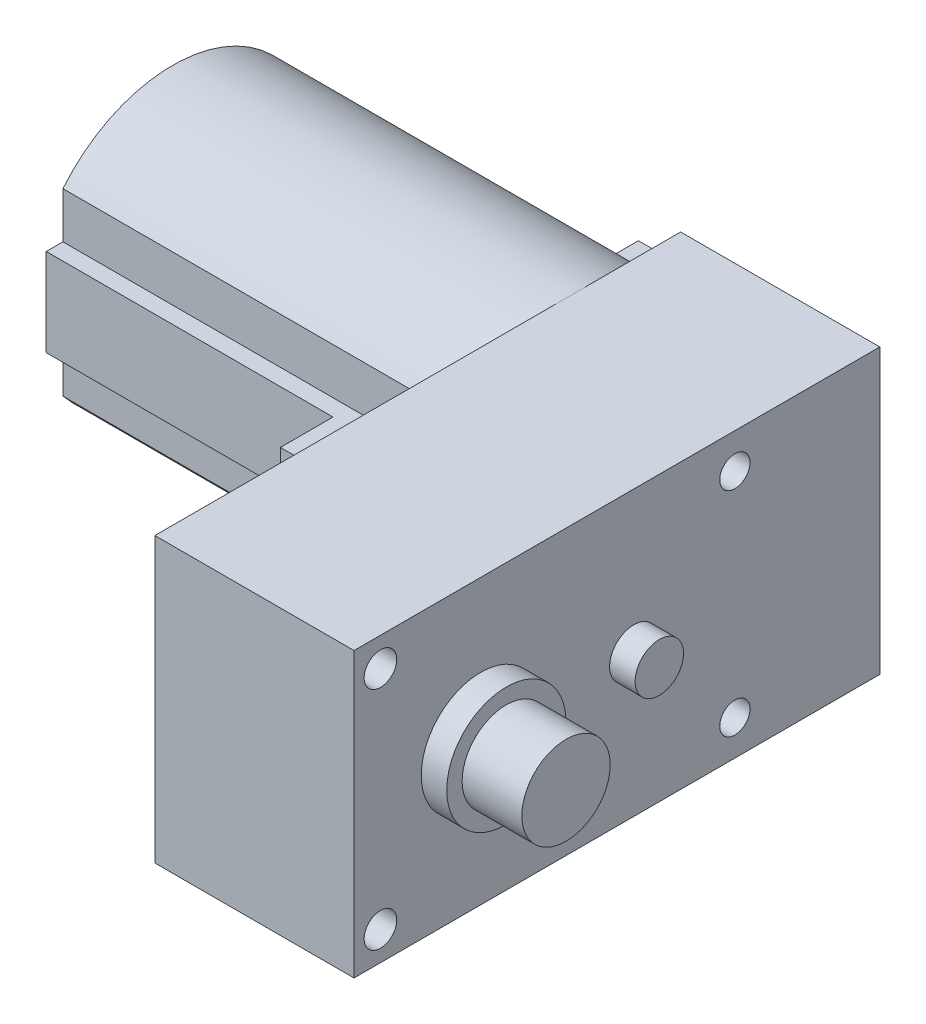
ISO-10303-21;
HEADER;
FILE_DESCRIPTION(('STEP AP214'),'2;1');
FILE_NAME('part.step','',(''),(''),'','','');
FILE_SCHEMA(('AUTOMOTIVE_DESIGN { 1 0 10303 214 1 1 1 1 }'));
ENDSEC;
DATA;
#1=APPLICATION_CONTEXT('core data for automotive mechanical design processes');
#2=APPLICATION_PROTOCOL_DEFINITION('international standard','automotive_design',2000,#1);
#3=PRODUCT_CONTEXT('',#1,'mechanical');
#4=PRODUCT('Part','Part','',(#3));
#5=PRODUCT_RELATED_PRODUCT_CATEGORY('part','',(#4));
#6=PRODUCT_DEFINITION_FORMATION('','',#4);
#7=PRODUCT_DEFINITION_CONTEXT('part definition',#1,'design');
#8=PRODUCT_DEFINITION('design','',#6,#7);
#9=PRODUCT_DEFINITION_SHAPE('','',#8);
#10=(LENGTH_UNIT() NAMED_UNIT(*) SI_UNIT(.MILLI.,.METRE.));
#11=(NAMED_UNIT(*) PLANE_ANGLE_UNIT() SI_UNIT($,.RADIAN.));
#12=(NAMED_UNIT(*) SI_UNIT($,.STERADIAN.) SOLID_ANGLE_UNIT());
#13=UNCERTAINTY_MEASURE_WITH_UNIT(LENGTH_MEASURE(1.E-05),#10,'distance_accuracy_value','');
#14=(GEOMETRIC_REPRESENTATION_CONTEXT(3) GLOBAL_UNCERTAINTY_ASSIGNED_CONTEXT((#13)) GLOBAL_UNIT_ASSIGNED_CONTEXT((#10,
#11,#12)) REPRESENTATION_CONTEXT('',''));
#15=CARTESIAN_POINT('',(0.,0.,0.));
#16=DIRECTION('',(0.,0.,1.));
#17=DIRECTION('',(1.,0.,0.));
#18=AXIS2_PLACEMENT_3D('',#15,#16,#17);
#19=CARTESIAN_POINT('',(-4.9784,10.274808,-11.134852));
#20=DIRECTION('',(-1.,0.,0.));
#21=DIRECTION('',(0.,0.,1.));
#22=AXIS2_PLACEMENT_3D('',#19,#20,#21);
#23=PLANE('',#22);
#24=CARTESIAN_POINT('',(-4.9784,11.303,-10.10666));
#25=DIRECTION('',(1.,0.,0.));
#26=DIRECTION('',(0.,0.,-1.));
#27=AXIS2_PLACEMENT_3D('',#24,#25,#26);
#28=CIRCLE('',#27,1.016);
#29=CARTESIAN_POINT('',(-4.9784,11.303,-11.12266));
#30=VERTEX_POINT('',#29);
#31=EDGE_CURVE('E19',#30,#30,#28,.T.);
#32=ORIENTED_EDGE('',*,*,#31,.F.);
#33=EDGE_LOOP('',(#32));
#34=FACE_BOUND('',#33,.T.);
#35=ADVANCED_FACE('F16',(#34),#23,.T.);
#36=CARTESIAN_POINT('',(-4.9784,11.303,-10.10666));
#37=DIRECTION('',(1.,0.,0.));
#38=DIRECTION('',(0.,0.,-1.));
#39=AXIS2_PLACEMENT_3D('',#36,#37,#38);
#40=CYLINDRICAL_SURFACE('',#39,1.016);
#41=ORIENTED_EDGE('',*,*,#31,.T.);
#42=EDGE_LOOP('',(#41));
#43=FACE_BOUND('',#42,.T.);
#44=CARTESIAN_POINT('',(0.,11.303,-10.10666));
#45=DIRECTION('',(1.,0.,0.));
#46=DIRECTION('',(0.,0.,-1.));
#47=AXIS2_PLACEMENT_3D('',#44,#45,#46);
#48=CIRCLE('',#47,1.016);
#49=CARTESIAN_POINT('',(0.,11.303,-11.12266));
#50=VERTEX_POINT('',#49);
#51=EDGE_CURVE('E425',#50,#50,#48,.T.);
#52=ORIENTED_EDGE('',*,*,#51,.F.);
#53=EDGE_LOOP('',(#52));
#54=FACE_BOUND('',#53,.T.);
#55=ADVANCED_FACE('F432',(#43,#54),#40,.T.);
#56=CARTESIAN_POINT('',(0.,7.7300328,-13.6796272));
#57=DIRECTION('',(-1.,0.,0.));
#58=DIRECTION('',(0.,0.,1.));
#59=AXIS2_PLACEMENT_3D('',#56,#57,#58);
#60=PLANE('',#59);
#61=CARTESIAN_POINT('',(0.,11.303,-10.10666));
#62=DIRECTION('',(1.,0.,0.));
#63=DIRECTION('',(0.,0.,-1.));
#64=AXIS2_PLACEMENT_3D('',#61,#62,#63);
#65=CIRCLE('',#64,3.5306);
#66=CARTESIAN_POINT('',(0.,11.303,-13.63726));
#67=VERTEX_POINT('',#66);
#68=EDGE_CURVE('E423',#67,#67,#65,.F.);
#69=ORIENTED_EDGE('',*,*,#68,.T.);
#70=EDGE_LOOP('',(#69));
#71=FACE_BOUND('',#70,.T.);
#72=ORIENTED_EDGE('',*,*,#51,.T.);
#73=EDGE_LOOP('',(#72));
#74=FACE_BOUND('',#73,.T.);
#75=ADVANCED_FACE('F440',(#71,#74),#60,.T.);
#76=CARTESIAN_POINT('',(-2.794,11.303,-10.10666));
#77=DIRECTION('',(1.,0.,0.));
#78=DIRECTION('',(0.,0.,-1.));
#79=AXIS2_PLACEMENT_3D('',#76,#77,#78);
#80=CYLINDRICAL_SURFACE('',#79,3.5306);
#81=ORIENTED_EDGE('',*,*,#68,.F.);
#82=EDGE_LOOP('',(#81));
#83=FACE_BOUND('',#82,.T.);
#84=CARTESIAN_POINT('',(-2.794,11.303,-10.10666));
#85=DIRECTION('',(1.,0.,0.));
#86=DIRECTION('',(0.,0.,-1.));
#87=AXIS2_PLACEMENT_3D('',#84,#85,#86);
#88=CIRCLE('',#87,3.5306);
#89=CARTESIAN_POINT('',(-2.794,11.303,-13.63726));
#90=VERTEX_POINT('',#89);
#91=EDGE_CURVE('E420',#90,#90,#88,.T.);
#92=ORIENTED_EDGE('',*,*,#91,.F.);
#93=EDGE_LOOP('',(#92));
#94=FACE_BOUND('',#93,.T.);
#95=ADVANCED_FACE('F596',(#83,#94),#80,.F.);
#96=CARTESIAN_POINT('',(22.6695,7.7405543182,-6.5442143182));
#97=DIRECTION('',(1.,0.,0.));
#98=DIRECTION('',(0.,0.,-1.));
#99=AXIS2_PLACEMENT_3D('',#96,#97,#98);
#100=PLANE('',#99);
#101=CARTESIAN_POINT('',(22.6695,11.303,-10.10666));
#102=DIRECTION('',(-1.,0.,0.));
#103=DIRECTION('',(0.,0.,1.));
#104=AXIS2_PLACEMENT_3D('',#101,#102,#103);
#105=CIRCLE('',#104,3.5202032466);
#106=CARTESIAN_POINT('',(22.6695,11.303,-6.5864567534));
#107=VERTEX_POINT('',#106);
#108=EDGE_CURVE('E417',#107,#107,#105,.T.);
#109=ORIENTED_EDGE('',*,*,#108,.F.);
#110=EDGE_LOOP('',(#109));
#111=FACE_BOUND('',#110,.T.);
#112=ADVANCED_FACE('F592',(#111),#100,.T.);
#113=CARTESIAN_POINT('',(-33.02,10.2940866,-34.1752239532));
#114=DIRECTION('',(-1.,0.,0.));
#115=DIRECTION('',(0.,0.,1.));
#116=AXIS2_PLACEMENT_3D('',#113,#114,#115);
#117=PLANE('',#116);
#118=CARTESIAN_POINT('',(-33.02,11.303,-33.1663105532));
#119=DIRECTION('',(1.,0.,0.));
#120=DIRECTION('',(0.,0.,-1.));
#121=AXIS2_PLACEMENT_3D('',#118,#119,#120);
#122=CIRCLE('',#121,0.99695000000001);
#123=CARTESIAN_POINT('',(-33.02,11.303,-34.1632605532));
#124=VERTEX_POINT('',#123);
#125=EDGE_CURVE('E357',#124,#124,#122,.T.);
#126=ORIENTED_EDGE('',*,*,#125,.F.);
#127=EDGE_LOOP('',(#126));
#128=FACE_BOUND('',#127,.T.);
#129=ADVANCED_FACE('F588',(#128),#117,.T.);
#130=CARTESIAN_POINT('',(-2.794,6.48335,-14.92631));
#131=DIRECTION('',(-1.,0.,0.));
#132=DIRECTION('',(0.,0.,1.));
#133=AXIS2_PLACEMENT_3D('',#130,#131,#132);
#134=PLANE('',#133);
#135=CARTESIAN_POINT('',(-2.794,11.303,-10.10666));
#136=DIRECTION('',(1.,0.,0.));
#137=DIRECTION('',(0.,0.,-1.));
#138=AXIS2_PLACEMENT_3D('',#135,#136,#137);
#139=CIRCLE('',#138,4.7625);
#140=CARTESIAN_POINT('',(-2.794,11.303,-14.86916));
#141=VERTEX_POINT('',#140);
#142=EDGE_CURVE('E251',#141,#141,#139,.T.);
#143=ORIENTED_EDGE('',*,*,#142,.F.);
#144=EDGE_LOOP('',(#143));
#145=FACE_BOUND('',#144,.T.);
#146=ORIENTED_EDGE('',*,*,#91,.T.);
#147=EDGE_LOOP('',(#146));
#148=FACE_BOUND('',#147,.T.);
#149=ADVANCED_FACE('F584',(#145,#148),#134,.T.);
#150=CARTESIAN_POINT('',(-8.89,7.8105,-23.0891211064));
#151=DIRECTION('',(1.,0.,0.));
#152=DIRECTION('',(0.,0.,-1.));
#153=AXIS2_PLACEMENT_3D('',#150,#151,#152);
#154=PLANE('',#153);
#155=DIRECTION('',(0.,1.,0.));
#156=VECTOR('',#155,1.);
#157=CARTESIAN_POINT('',(-8.89,7.8105,-18.8981211064));
#158=LINE('',#157,#156);
#159=CARTESIAN_POINT('',(-8.89,7.8105,-18.8981211064));
#160=VERTEX_POINT('',#159);
#161=CARTESIAN_POINT('',(-8.89,14.7955,-18.8981211064));
#162=VERTEX_POINT('',#161);
#163=EDGE_CURVE('E241',#160,#162,#158,.T.);
#164=ORIENTED_EDGE('',*,*,#163,.T.);
#165=DIRECTION('',(0.,0.,-1.));
#166=VECTOR('',#165,1.);
#167=CARTESIAN_POINT('',(-8.89,14.7955,-24.4226211064));
#168=LINE('',#167,#166);
#169=CARTESIAN_POINT('',(-8.89,14.7955000008717,-23.0891211072467));
#170=VERTEX_POINT('',#169);
#171=EDGE_CURVE('E250',#162,#170,#168,.T.);
#172=ORIENTED_EDGE('',*,*,#171,.T.);
#173=DIRECTION('',(0.,1.,0.));
#174=VECTOR('',#173,1.);
#175=CARTESIAN_POINT('',(-8.89,7.8105,-23.0891211064));
#176=LINE('',#175,#174);
#177=CARTESIAN_POINT('',(-8.89,7.8105,-23.0891211068233));
#178=VERTEX_POINT('',#177);
#179=EDGE_CURVE('E280',#170,#178,#176,.F.);
#180=ORIENTED_EDGE('',*,*,#179,.T.);
#181=DIRECTION('',(0.,0.,1.));
#182=VECTOR('',#181,1.);
#183=CARTESIAN_POINT('',(-8.89,7.8105,-24.4226211064));
#184=LINE('',#183,#182);
#185=EDGE_CURVE('E230',#178,#160,#184,.T.);
#186=ORIENTED_EDGE('',*,*,#185,.T.);
#187=EDGE_LOOP('',(#164,#172,#180,#186));
#188=FACE_BOUND('',#187,.T.);
#189=ADVANCED_FACE('F580',(#188),#154,.F.);
#190=CARTESIAN_POINT('',(22.6695,11.303,-10.10666));
#191=DIRECTION('',(-1.,0.,0.));
#192=DIRECTION('',(0.,0.,1.));
#193=AXIS2_PLACEMENT_3D('',#190,#191,#192);
#194=CYLINDRICAL_SURFACE('',#193,3.5202032466);
#195=ORIENTED_EDGE('',*,*,#108,.T.);
#196=EDGE_LOOP('',(#195));
#197=FACE_BOUND('',#196,.T.);
#198=CARTESIAN_POINT('',(17.907,11.303,-10.10666));
#199=DIRECTION('',(-1.,0.,0.));
#200=DIRECTION('',(0.,0.,1.));
#201=AXIS2_PLACEMENT_3D('',#198,#199,#200);
#202=CIRCLE('',#201,3.5202032466);
#203=CARTESIAN_POINT('',(17.907,11.303,-6.5864567534));
#204=VERTEX_POINT('',#203);
#205=EDGE_CURVE('E215',#204,#204,#202,.T.);
#206=ORIENTED_EDGE('',*,*,#205,.F.);
#207=EDGE_LOOP('',(#206));
#208=FACE_BOUND('',#207,.T.);
#209=ADVANCED_FACE('F576',(#197,#208),#194,.T.);
#210=CARTESIAN_POINT('',(-33.02,11.303,-33.1663105532));
#211=DIRECTION('',(1.,0.,0.));
#212=DIRECTION('',(0.,0.,-1.));
#213=AXIS2_PLACEMENT_3D('',#210,#211,#212);
#214=CYLINDRICAL_SURFACE('',#213,0.99695000000001);
#215=ORIENTED_EDGE('',*,*,#125,.T.);
#216=EDGE_LOOP('',(#215));
#217=FACE_BOUND('',#216,.T.);
#218=CARTESIAN_POINT('',(-31.75,11.303,-33.1663105532));
#219=DIRECTION('',(1.,0.,0.));
#220=DIRECTION('',(0.,0.,-1.));
#221=AXIS2_PLACEMENT_3D('',#218,#219,#220);
#222=CIRCLE('',#221,0.99695000000001);
#223=CARTESIAN_POINT('',(-31.75,11.303,-34.1632605532));
#224=VERTEX_POINT('',#223);
#225=EDGE_CURVE('E255',#224,#224,#222,.T.);
#226=ORIENTED_EDGE('',*,*,#225,.F.);
#227=EDGE_LOOP('',(#226));
#228=FACE_BOUND('',#227,.T.);
#229=ADVANCED_FACE('F572',(#217,#228),#214,.T.);
#230=CARTESIAN_POINT('',(-8.89,7.8105,-23.0891211064));
#231=DIRECTION('',(0.,0.,-1.));
#232=DIRECTION('',(-1.,0.,0.));
#233=AXIS2_PLACEMENT_3D('',#230,#231,#232);
#234=PLANE('',#233);
#235=DIRECTION('',(0.,1.,0.));
#236=VECTOR('',#235,1.);
#237=CARTESIAN_POINT('',(-31.75,-0.135636,-23.089121107035));
#238=LINE('',#237,#236);
#239=CARTESIAN_POINT('',(-31.75,7.81049999891034,-23.0891211069821));
#240=VERTEX_POINT('',#239);
#241=CARTESIAN_POINT('',(-31.75,14.7955000017435,-23.0891211071408));
#242=VERTEX_POINT('',#241);
#243=EDGE_CURVE('E326',#240,#242,#238,.T.);
#244=ORIENTED_EDGE('',*,*,#243,.F.);
#245=DIRECTION('',(1.,0.,0.));
#246=VECTOR('',#245,1.);
#247=CARTESIAN_POINT('',(-31.75,7.8105,-23.089121107035));
#248=LINE('',#247,#246);
#249=EDGE_CURVE('E240',#240,#178,#248,.T.);
#250=ORIENTED_EDGE('',*,*,#249,.T.);
#251=ORIENTED_EDGE('',*,*,#179,.F.);
#252=DIRECTION('',(1.,0.,0.));
#253=VECTOR('',#252,1.);
#254=CARTESIAN_POINT('',(-31.75,14.7955,-23.08912110767));
#255=LINE('',#254,#253);
#256=EDGE_CURVE('E336',#170,#242,#255,.F.);
#257=ORIENTED_EDGE('',*,*,#256,.T.);
#258=EDGE_LOOP('',(#244,#250,#251,#257));
#259=FACE_BOUND('',#258,.T.);
#260=ADVANCED_FACE('F568',(#259),#234,.F.);
#261=CARTESIAN_POINT('',(-8.89,7.8105,-47.4345));
#262=DIRECTION('',(0.,0.,1.));
#263=DIRECTION('',(1.,0.,0.));
#264=AXIS2_PLACEMENT_3D('',#261,#262,#263);
#265=PLANE('',#264);
#266=DIRECTION('',(0.,1.,0.));
#267=VECTOR('',#266,1.);
#268=CARTESIAN_POINT('',(0.,7.8105,-47.4345));
#269=LINE('',#268,#267);
#270=CARTESIAN_POINT('',(0.,14.7954999997742,-47.4345));
#271=VERTEX_POINT('',#270);
#272=CARTESIAN_POINT('',(7.05555829810183E-09,7.8105,-47.4345));
#273=VERTEX_POINT('',#272);
#274=EDGE_CURVE('E290',#271,#273,#269,.F.);
#275=ORIENTED_EDGE('',*,*,#274,.T.);
#276=DIRECTION('',(1.,0.,0.));
#277=VECTOR('',#276,1.);
#278=CARTESIAN_POINT('',(0.,7.8105,-47.4345));
#279=LINE('',#278,#277);
#280=CARTESIAN_POINT('',(-8.89,7.8105,-47.4345));
#281=VERTEX_POINT('',#280);
#282=EDGE_CURVE('E276',#273,#281,#279,.F.);
#283=ORIENTED_EDGE('',*,*,#282,.T.);
#284=DIRECTION('',(0.,1.,0.));
#285=VECTOR('',#284,1.);
#286=CARTESIAN_POINT('',(-8.89,7.8105,-47.4345));
#287=LINE('',#286,#285);
#288=CARTESIAN_POINT('',(-8.89,14.7955,-47.4345));
#289=VERTEX_POINT('',#288);
#290=EDGE_CURVE('E271',#281,#289,#287,.T.);
#291=ORIENTED_EDGE('',*,*,#290,.T.);
#292=DIRECTION('',(1.,0.,0.));
#293=VECTOR('',#292,1.);
#294=CARTESIAN_POINT('',(-31.75,14.7955,-47.4345));
#295=LINE('',#294,#293);
#296=EDGE_CURVE('E306',#289,#271,#295,.T.);
#297=ORIENTED_EDGE('',*,*,#296,.T.);
#298=EDGE_LOOP('',(#275,#283,#291,#297));
#299=FACE_BOUND('',#298,.T.);
#300=ADVANCED_FACE('F564',(#299),#265,.F.);
#301=CARTESIAN_POINT('',(-8.89,7.8105,-43.2435));
#302=DIRECTION('',(1.,0.,0.));
#303=DIRECTION('',(0.,0.,-1.));
#304=AXIS2_PLACEMENT_3D('',#301,#302,#303);
#305=PLANE('',#304);
#306=ORIENTED_EDGE('',*,*,#290,.F.);
#307=DIRECTION('',(0.,0.,1.));
#308=VECTOR('',#307,1.);
#309=CARTESIAN_POINT('',(-8.89,7.8105,-47.4345));
#310=LINE('',#309,#308);
#311=CARTESIAN_POINT('',(-8.89,7.8105,-43.2434999991533));
#312=VERTEX_POINT('',#311);
#313=EDGE_CURVE('E266',#281,#312,#310,.T.);
#314=ORIENTED_EDGE('',*,*,#313,.T.);
#315=DIRECTION('',(0.,1.,0.));
#316=VECTOR('',#315,1.);
#317=CARTESIAN_POINT('',(-8.89,7.8105,-43.2435));
#318=LINE('',#317,#316);
#319=CARTESIAN_POINT('',(-8.89,14.7955,-43.2434999995767));
#320=VERTEX_POINT('',#319);
#321=EDGE_CURVE('E269',#312,#320,#318,.T.);
#322=ORIENTED_EDGE('',*,*,#321,.T.);
#323=DIRECTION('',(0.,0.,-1.));
#324=VECTOR('',#323,1.);
#325=CARTESIAN_POINT('',(-8.89,14.7955,-47.4345));
#326=LINE('',#325,#324);
#327=EDGE_CURVE('E310',#320,#289,#326,.T.);
#328=ORIENTED_EDGE('',*,*,#327,.T.);
#329=EDGE_LOOP('',(#306,#314,#322,#328));
#330=FACE_BOUND('',#329,.T.);
#331=ADVANCED_FACE('F560',(#330),#305,.F.);
#332=CARTESIAN_POINT('',(-31.75,7.8105,-43.2435));
#333=DIRECTION('',(0.,0.,1.));
#334=DIRECTION('',(1.,0.,0.));
#335=AXIS2_PLACEMENT_3D('',#332,#333,#334);
#336=PLANE('',#335);
#337=DIRECTION('',(0.,1.,0.));
#338=VECTOR('',#337,1.);
#339=CARTESIAN_POINT('',(-31.75,-0.135636,-43.243499999365));
#340=LINE('',#339,#338);
#341=CARTESIAN_POINT('',(-31.75,14.795500000323,-43.243499999365));
#342=VERTEX_POINT('',#341);
#343=CARTESIAN_POINT('',(-31.75,7.8105,-43.2434999989417));
#344=VERTEX_POINT('',#343);
#345=EDGE_CURVE('E256',#342,#344,#340,.F.);
#346=ORIENTED_EDGE('',*,*,#345,.F.);
#347=DIRECTION('',(1.,0.,0.));
#348=VECTOR('',#347,1.);
#349=CARTESIAN_POINT('',(-31.75,14.7955,-43.243499999365));
#350=LINE('',#349,#348);
#351=EDGE_CURVE('E315',#342,#320,#350,.T.);
#352=ORIENTED_EDGE('',*,*,#351,.T.);
#353=ORIENTED_EDGE('',*,*,#321,.F.);
#354=DIRECTION('',(1.,0.,0.));
#355=VECTOR('',#354,1.);
#356=CARTESIAN_POINT('',(0.,7.8105,-43.24349999873));
#357=LINE('',#356,#355);
#358=EDGE_CURVE('E262',#312,#344,#357,.F.);
#359=ORIENTED_EDGE('',*,*,#358,.T.);
#360=EDGE_LOOP('',(#346,#352,#353,#359));
#361=FACE_BOUND('',#360,.T.);
#362=ADVANCED_FACE('F556',(#361),#336,.F.);
#363=CARTESIAN_POINT('',(-2.794,11.303,-10.10666));
#364=DIRECTION('',(1.,0.,0.));
#365=DIRECTION('',(0.,0.,-1.));
#366=AXIS2_PLACEMENT_3D('',#363,#364,#365);
#367=CYLINDRICAL_SURFACE('',#366,4.7625);
#368=ORIENTED_EDGE('',*,*,#142,.T.);
#369=EDGE_LOOP('',(#368));
#370=FACE_BOUND('',#369,.T.);
#371=CARTESIAN_POINT('',(0.,11.303,-10.10666));
#372=DIRECTION('',(1.,0.,0.));
#373=DIRECTION('',(0.,0.,-1.));
#374=AXIS2_PLACEMENT_3D('',#371,#372,#373);
#375=CIRCLE('',#374,4.7625);
#376=CARTESIAN_POINT('',(0.,11.303,-14.86916));
#377=VERTEX_POINT('',#376);
#378=EDGE_CURVE('E188',#377,#377,#375,.T.);
#379=ORIENTED_EDGE('',*,*,#378,.F.);
#380=EDGE_LOOP('',(#379));
#381=FACE_BOUND('',#380,.T.);
#382=ADVANCED_FACE('F552',(#370,#381),#367,.T.);
#383=CARTESIAN_POINT('',(0.,14.7955,-24.4226211064));
#384=DIRECTION('',(0.,0.,-1.));
#385=DIRECTION('',(-1.,0.,0.));
#386=AXIS2_PLACEMENT_3D('',#383,#384,#385);
#387=PLANE('',#386);
#388=DIRECTION('',(0.,1.,0.));
#389=VECTOR('',#388,1.);
#390=CARTESIAN_POINT('',(0.,0.,-24.4226211121658));
#391=LINE('',#390,#389);
#392=CARTESIAN_POINT('',(0.,18.4658000075913,-24.4226211115941));
#393=VERTEX_POINT('',#392);
#394=CARTESIAN_POINT('',(0.,14.7954999997742,-24.4226211116857));
#395=VERTEX_POINT('',#394);
#396=EDGE_CURVE('E187',#393,#395,#391,.F.);
#397=ORIENTED_EDGE('',*,*,#396,.F.);
#398=DIRECTION('',(1.,0.,0.));
#399=VECTOR('',#398,1.);
#400=CARTESIAN_POINT('',(-31.75,18.4658000068934,-24.4226211110224));
#401=LINE('',#400,#399);
#402=CARTESIAN_POINT('',(-31.75,18.4658000067122,-24.422621110874));
#403=VERTEX_POINT('',#402);
#404=EDGE_CURVE('E165',#403,#393,#401,.T.);
#405=ORIENTED_EDGE('',*,*,#404,.F.);
#406=DIRECTION('',(0.,1.,0.));
#407=VECTOR('',#406,1.);
#408=CARTESIAN_POINT('',(-31.75,-0.135636,-24.4226211107255));
#409=LINE('',#408,#407);
#410=CARTESIAN_POINT('',(-31.75,14.7955000017435,-24.4226211100046));
#411=VERTEX_POINT('',#410);
#412=EDGE_CURVE('E333',#411,#403,#409,.T.);
#413=ORIENTED_EDGE('',*,*,#412,.F.);
#414=DIRECTION('',(1.,0.,0.));
#415=VECTOR('',#414,1.);
#416=CARTESIAN_POINT('',(-31.75,14.7955,-24.4226211107255));
#417=LINE('',#416,#415);
#418=EDGE_CURVE('E247',#411,#395,#417,.T.);
#419=ORIENTED_EDGE('',*,*,#418,.T.);
#420=EDGE_LOOP('',(#397,#405,#413,#419));
#421=FACE_BOUND('',#420,.T.);
#422=ADVANCED_FACE('F548',(#421),#387,.F.);
#423=CARTESIAN_POINT('',(-31.75,14.7955,-24.4226211064));
#424=DIRECTION('',(0.,-1.,0.));
#425=DIRECTION('',(0.,0.,-1.));
#426=AXIS2_PLACEMENT_3D('',#423,#424,#425);
#427=PLANE('',#426);
#428=ORIENTED_EDGE('',*,*,#256,.F.);
#429=ORIENTED_EDGE('',*,*,#171,.F.);
#430=DIRECTION('',(-1.,0.,0.));
#431=VECTOR('',#430,1.);
#432=CARTESIAN_POINT('',(0.,14.7955,-18.8981211064));
#433=LINE('',#432,#431);
#434=CARTESIAN_POINT('',(0.,14.7954999997742,-18.8981211051535));
#435=VERTEX_POINT('',#434);
#436=EDGE_CURVE('E237',#162,#435,#433,.F.);
#437=ORIENTED_EDGE('',*,*,#436,.T.);
#438=DIRECTION('',(0.,0.,1.));
#439=VECTOR('',#438,1.);
#440=CARTESIAN_POINT('',(0.,14.7954999996613,-33.365308428));
#441=LINE('',#440,#439);
#442=EDGE_CURVE('E234',#395,#435,#441,.T.);
#443=ORIENTED_EDGE('',*,*,#442,.F.);
#444=ORIENTED_EDGE('',*,*,#418,.F.);
#445=DIRECTION('',(0.,0.,1.));
#446=VECTOR('',#445,1.);
#447=CARTESIAN_POINT('',(-31.75,14.7955000026152,-43.2435));
#448=LINE('',#447,#446);
#449=EDGE_CURVE('E330',#242,#411,#448,.F.);
#450=ORIENTED_EDGE('',*,*,#449,.F.);
#451=EDGE_LOOP('',(#428,#429,#437,#443,#444,#450));
#452=FACE_BOUND('',#451,.T.);
#453=ADVANCED_FACE('F544',(#452),#427,.F.);
#454=CARTESIAN_POINT('',(0.,7.8105,-18.8981211064));
#455=DIRECTION('',(0.,0.,-1.));
#456=DIRECTION('',(-1.,0.,0.));
#457=AXIS2_PLACEMENT_3D('',#454,#455,#456);
#458=PLANE('',#457);
#459=ORIENTED_EDGE('',*,*,#163,.F.);
#460=DIRECTION('',(1.,0.,0.));
#461=VECTOR('',#460,1.);
#462=CARTESIAN_POINT('',(-31.75,7.8105,-18.8981211064));
#463=LINE('',#462,#461);
#464=CARTESIAN_POINT('',(0.,7.81050000022578,-18.8981211051535));
#465=VERTEX_POINT('',#464);
#466=EDGE_CURVE('E219',#160,#465,#463,.T.);
#467=ORIENTED_EDGE('',*,*,#466,.T.);
#468=DIRECTION('',(0.,1.,0.));
#469=VECTOR('',#468,1.);
#470=CARTESIAN_POINT('',(0.,0.,-18.8981211045303));
#471=LINE('',#470,#469);
#472=EDGE_CURVE('E225',#435,#465,#471,.F.);
#473=ORIENTED_EDGE('',*,*,#472,.F.);
#474=ORIENTED_EDGE('',*,*,#436,.F.);
#475=EDGE_LOOP('',(#459,#467,#473,#474));
#476=FACE_BOUND('',#475,.T.);
#477=ADVANCED_FACE('F540',(#476),#458,.F.);
#478=CARTESIAN_POINT('',(-31.75,7.8105,-24.4226211064));
#479=DIRECTION('',(0.,1.,0.));
#480=DIRECTION('',(0.,0.,1.));
#481=AXIS2_PLACEMENT_3D('',#478,#479,#480);
#482=PLANE('',#481);
#483=ORIENTED_EDGE('',*,*,#466,.F.);
#484=ORIENTED_EDGE('',*,*,#185,.F.);
#485=ORIENTED_EDGE('',*,*,#249,.F.);
#486=DIRECTION('',(0.,0.,1.));
#487=VECTOR('',#486,1.);
#488=CARTESIAN_POINT('',(-31.75,7.81049999738482,-43.2435));
#489=LINE('',#488,#487);
#490=CARTESIAN_POINT('',(-31.75,7.81049999738482,-24.4226211089788));
#491=VERTEX_POINT('',#490);
#492=EDGE_CURVE('E323',#491,#240,#489,.T.);
#493=ORIENTED_EDGE('',*,*,#492,.F.);
#494=DIRECTION('',(-1.,0.,0.));
#495=VECTOR('',#494,1.);
#496=CARTESIAN_POINT('',(0.,7.81049999738482,-24.4226211064));
#497=LINE('',#496,#495);
#498=CARTESIAN_POINT('',(0.,7.81049999935405,-24.4226211112612));
#499=VERTEX_POINT('',#498);
#500=EDGE_CURVE('E216',#491,#499,#497,.F.);
#501=ORIENTED_EDGE('',*,*,#500,.T.);
#502=DIRECTION('',(0.,0.,1.));
#503=VECTOR('',#502,1.);
#504=CARTESIAN_POINT('',(0.,7.81050000033867,-33.365308428));
#505=LINE('',#504,#503);
#506=EDGE_CURVE('E222',#465,#499,#505,.F.);
#507=ORIENTED_EDGE('',*,*,#506,.F.);
#508=EDGE_LOOP('',(#483,#484,#485,#493,#501,#507));
#509=FACE_BOUND('',#508,.T.);
#510=ADVANCED_FACE('F536',(#509),#482,.F.);
#511=CARTESIAN_POINT('',(0.,4.1402,-24.4226211064));
#512=DIRECTION('',(0.,0.,-1.));
#513=DIRECTION('',(-1.,0.,0.));
#514=AXIS2_PLACEMENT_3D('',#511,#512,#513);
#515=PLANE('',#514);
#516=DIRECTION('',(1.,0.,0.));
#517=VECTOR('',#516,1.);
#518=CARTESIAN_POINT('',(-31.75,4.14019999249601,-24.4226211115226));
#519=LINE('',#518,#517);
#520=CARTESIAN_POINT('',(0.,4.14019999117202,-24.4226211126072));
#521=VERTEX_POINT('',#520);
#522=CARTESIAN_POINT('',(-31.75,4.14019999319386,-24.4226211109509));
#523=VERTEX_POINT('',#522);
#524=EDGE_CURVE('E166',#521,#523,#519,.F.);
#525=ORIENTED_EDGE('',*,*,#524,.F.);
#526=DIRECTION('',(0.,1.,0.));
#527=VECTOR('',#526,1.);
#528=CARTESIAN_POINT('',(0.,0.,-24.4226211136918));
#529=LINE('',#528,#527);
#530=EDGE_CURVE('E224',#499,#521,#529,.F.);
#531=ORIENTED_EDGE('',*,*,#530,.F.);
#532=ORIENTED_EDGE('',*,*,#500,.F.);
#533=DIRECTION('',(0.,1.,0.));
#534=VECTOR('',#533,1.);
#535=CARTESIAN_POINT('',(-31.75,-0.135636,-24.4226211103792));
#536=LINE('',#535,#534);
#537=EDGE_CURVE('E327',#523,#491,#536,.T.);
#538=ORIENTED_EDGE('',*,*,#537,.F.);
#539=EDGE_LOOP('',(#525,#531,#532,#538));
#540=FACE_BOUND('',#539,.T.);
#541=ADVANCED_FACE('F532',(#540),#515,.F.);
#542=CARTESIAN_POINT('',(17.907,9.3494352,-20.3501752));
#543=DIRECTION('',(1.,0.,0.));
#544=DIRECTION('',(0.,0.,-1.));
#545=AXIS2_PLACEMENT_3D('',#542,#543,#544);
#546=PLANE('',#545);
#547=CARTESIAN_POINT('',(17.907,11.303,-22.30374));
#548=DIRECTION('',(-1.,0.,0.));
#549=DIRECTION('',(0.,-1.,0.));
#550=AXIS2_PLACEMENT_3D('',#547,#548,#549);
#551=CIRCLE('',#550,1.9304);
#552=CARTESIAN_POINT('',(17.907,9.3726,-22.30374));
#553=VERTEX_POINT('',#552);
#554=EDGE_CURVE('E397',#553,#553,#551,.T.);
#555=ORIENTED_EDGE('',*,*,#554,.F.);
#556=EDGE_LOOP('',(#555));
#557=FACE_BOUND('',#556,.T.);
#558=ADVANCED_FACE('F528',(#557),#546,.T.);
#559=CARTESIAN_POINT('',(0.,1.581912,-31.579058));
#560=DIRECTION('',(-1.,0.,0.));
#561=DIRECTION('',(0.,0.,1.));
#562=AXIS2_PLACEMENT_3D('',#559,#560,#561);
#563=PLANE('',#562);
#564=CARTESIAN_POINT('',(0.,2.80289,-30.35808));
#565=DIRECTION('',(-1.,0.,0.));
#566=DIRECTION('',(0.,0.,1.));
#567=AXIS2_PLACEMENT_3D('',#564,#565,#566);
#568=CIRCLE('',#567,1.2065);
#569=CARTESIAN_POINT('',(0.,2.80289,-29.15158));
#570=VERTEX_POINT('',#569);
#571=EDGE_CURVE('E394',#570,#570,#568,.F.);
#572=ORIENTED_EDGE('',*,*,#571,.T.);
#573=EDGE_LOOP('',(#572));
#574=FACE_BOUND('',#573,.T.);
#575=ADVANCED_FACE('F524',(#574),#563,.F.);
#576=CARTESIAN_POINT('',(0.,18.582132,-31.579058));
#577=DIRECTION('',(-1.,0.,0.));
#578=DIRECTION('',(0.,0.,1.));
#579=AXIS2_PLACEMENT_3D('',#576,#577,#578);
#580=PLANE('',#579);
#581=CARTESIAN_POINT('',(0.,19.80311,-30.35808));
#582=DIRECTION('',(-1.,0.,0.));
#583=DIRECTION('',(0.,0.,1.));
#584=AXIS2_PLACEMENT_3D('',#581,#582,#583);
#585=CIRCLE('',#584,1.2065);
#586=CARTESIAN_POINT('',(0.,19.80311,-29.15158));
#587=VERTEX_POINT('',#586);
#588=EDGE_CURVE('E385',#587,#587,#585,.F.);
#589=ORIENTED_EDGE('',*,*,#588,.T.);
#590=EDGE_LOOP('',(#589));
#591=FACE_BOUND('',#590,.T.);
#592=ADVANCED_FACE('F520',(#591),#580,.F.);
#593=CARTESIAN_POINT('',(17.907,6.4962024,-5.2998624));
#594=DIRECTION('',(1.,0.,0.));
#595=DIRECTION('',(0.,0.,-1.));
#596=AXIS2_PLACEMENT_3D('',#593,#594,#595);
#597=PLANE('',#596);
#598=CARTESIAN_POINT('',(17.907,11.303,-10.10666));
#599=DIRECTION('',(-1.,0.,0.));
#600=DIRECTION('',(0.,-1.,0.));
#601=AXIS2_PLACEMENT_3D('',#598,#599,#600);
#602=CIRCLE('',#601,4.7498);
#603=CARTESIAN_POINT('',(17.907,6.5532,-10.10666));
#604=VERTEX_POINT('',#603);
#605=EDGE_CURVE('E382',#604,#604,#602,.T.);
#606=ORIENTED_EDGE('',*,*,#605,.F.);
#607=EDGE_LOOP('',(#606));
#608=FACE_BOUND('',#607,.T.);
#609=ORIENTED_EDGE('',*,*,#205,.T.);
#610=EDGE_LOOP('',(#609));
#611=FACE_BOUND('',#610,.T.);
#612=ADVANCED_FACE('F516',(#608,#611),#597,.T.);
#613=CARTESIAN_POINT('',(-31.75,11.303,-33.1663105532));
#614=DIRECTION('',(1.,0.,0.));
#615=DIRECTION('',(0.,0.,-1.));
#616=AXIS2_PLACEMENT_3D('',#613,#614,#615);
#617=CYLINDRICAL_SURFACE('',#616,11.303);
#618=DIRECTION('',(1.,0.,0.));
#619=VECTOR('',#618,1.);
#620=CARTESIAN_POINT('',(-31.75,4.14019999467561,-41.91));
#621=LINE('',#620,#619);
#622=CARTESIAN_POINT('',(-31.75,4.14019999671242,-41.91));
#623=VERTEX_POINT('',#622);
#624=CARTESIAN_POINT('',(7.93750482008804E-09,4.14019999671242,-41.91));
#625=VERTEX_POINT('',#624);
#626=EDGE_CURVE('E196',#623,#625,#621,.T.);
#627=ORIENTED_EDGE('',*,*,#626,.T.);
#628=CARTESIAN_POINT('',(7.93750482008804E-09,11.303,-33.1663105532));
#629=DIRECTION('',(1.,0.,0.));
#630=DIRECTION('',(0.,0.,-1.));
#631=AXIS2_PLACEMENT_3D('',#628,#629,#630);
#632=CIRCLE('',#631,11.303);
#633=CARTESIAN_POINT('',(3.96875241004402E-09,0.,-33.1663105497075));
#634=VERTEX_POINT('',#633);
#635=EDGE_CURVE('E400',#634,#625,#632,.T.);
#636=ORIENTED_EDGE('',*,*,#635,.F.);
#637=CARTESIAN_POINT('',(0.,11.303,-33.1663105532));
#638=DIRECTION('',(1.,0.,0.));
#639=DIRECTION('',(0.,0.,-1.));
#640=AXIS2_PLACEMENT_3D('',#637,#638,#639);
#641=CIRCLE('',#640,11.303);
#642=EDGE_CURVE('E402',#521,#634,#641,.T.);
#643=ORIENTED_EDGE('',*,*,#642,.F.);
#644=ORIENTED_EDGE('',*,*,#524,.T.);
#645=CARTESIAN_POINT('',(-31.75,11.303,-33.1663105532));
#646=DIRECTION('',(1.,0.,0.));
#647=DIRECTION('',(0.,0.,-1.));
#648=AXIS2_PLACEMENT_3D('',#645,#646,#647);
#649=CIRCLE('',#648,11.303);
#650=EDGE_CURVE('E258',#623,#523,#649,.F.);
#651=ORIENTED_EDGE('',*,*,#650,.F.);
#652=EDGE_LOOP('',(#627,#636,#643,#644,#651));
#653=FACE_BOUND('',#652,.T.);
#654=ADVANCED_FACE('F513',(#653),#617,.T.);
#655=CARTESIAN_POINT('',(0.,18.4409588,-41.91));
#656=DIRECTION('',(-1.,0.,0.));
#657=DIRECTION('',(0.,0.,1.));
#658=AXIS2_PLACEMENT_3D('',#655,#656,#657);
#659=PLANE('',#658);
#660=DIRECTION('',(0.,1.,0.));
#661=VECTOR('',#660,1.);
#662=CARTESIAN_POINT('',(7.93750482008804E-09,0.,-41.91));
#663=LINE('',#662,#661);
#664=CARTESIAN_POINT('',(3.96875356652634E-09,22.606,-41.91));
#665=VERTEX_POINT('',#664);
#666=CARTESIAN_POINT('',(3.96875241004402E-09,18.4658000032876,-41.91));
#667=VERTEX_POINT('',#666);
#668=EDGE_CURVE('E160',#665,#667,#663,.F.);
#669=ORIENTED_EDGE('',*,*,#668,.T.);
#670=CARTESIAN_POINT('',(0.,11.303,-33.1663105532));
#671=DIRECTION('',(1.,0.,0.));
#672=DIRECTION('',(0.,0.,-1.));
#673=AXIS2_PLACEMENT_3D('',#670,#671,#672);
#674=CIRCLE('',#673,11.303);
#675=CARTESIAN_POINT('',(0.,22.606,-33.1663105497075));
#676=VERTEX_POINT('',#675);
#677=EDGE_CURVE('E155',#676,#667,#674,.F.);
#678=ORIENTED_EDGE('',*,*,#677,.F.);
#679=DIRECTION('',(0.,0.,-1.));
#680=VECTOR('',#679,1.);
#681=CARTESIAN_POINT('',(0.,22.606,0.));
#682=LINE('',#681,#680);
#683=EDGE_CURVE('E158',#676,#665,#682,.T.);
#684=ORIENTED_EDGE('',*,*,#683,.T.);
#685=EDGE_LOOP('',(#669,#678,#684));
#686=FACE_BOUND('',#685,.T.);
#687=ADVANCED_FACE('F157',(#686),#659,.T.);
#688=CARTESIAN_POINT('',(-31.75,11.303,-33.1663105532));
#689=DIRECTION('',(1.,0.,0.));
#690=DIRECTION('',(0.,0.,-1.));
#691=AXIS2_PLACEMENT_3D('',#688,#689,#690);
#692=CYLINDRICAL_SURFACE('',#691,11.303);
#693=ORIENTED_EDGE('',*,*,#404,.T.);
#694=CARTESIAN_POINT('',(0.,11.303,-33.1663105532));
#695=DIRECTION('',(1.,0.,0.));
#696=DIRECTION('',(0.,0.,-1.));
#697=AXIS2_PLACEMENT_3D('',#694,#695,#696);
#698=CIRCLE('',#697,11.303);
#699=EDGE_CURVE('E181',#676,#393,#698,.T.);
#700=ORIENTED_EDGE('',*,*,#699,.F.);
#701=ORIENTED_EDGE('',*,*,#677,.T.);
#702=DIRECTION('',(1.,0.,0.));
#703=VECTOR('',#702,1.);
#704=CARTESIAN_POINT('',(-31.75,18.4658000053244,-41.91));
#705=LINE('',#704,#703);
#706=CARTESIAN_POINT('',(-31.75,18.4658000032876,-41.91));
#707=VERTEX_POINT('',#706);
#708=EDGE_CURVE('E1027',#667,#707,#705,.F.);
#709=ORIENTED_EDGE('',*,*,#708,.T.);
#710=CARTESIAN_POINT('',(-31.75,11.303,-33.1663105532));
#711=DIRECTION('',(1.,0.,0.));
#712=DIRECTION('',(0.,0.,-1.));
#713=AXIS2_PLACEMENT_3D('',#710,#711,#712);
#714=CIRCLE('',#713,11.303);
#715=EDGE_CURVE('E259',#403,#707,#714,.F.);
#716=ORIENTED_EDGE('',*,*,#715,.F.);
#717=EDGE_LOOP('',(#693,#700,#701,#709,#716));
#718=FACE_BOUND('',#717,.T.);
#719=ADVANCED_FACE('F182',(#718),#692,.T.);
#720=CARTESIAN_POINT('',(-31.75,-0.135636,-43.2435));
#721=DIRECTION('',(-1.,0.,0.));
#722=DIRECTION('',(0.,0.,1.));
#723=AXIS2_PLACEMENT_3D('',#720,#721,#722);
#724=PLANE('',#723);
#725=ORIENTED_EDGE('',*,*,#492,.T.);
#726=ORIENTED_EDGE('',*,*,#243,.T.);
#727=ORIENTED_EDGE('',*,*,#449,.T.);
#728=ORIENTED_EDGE('',*,*,#412,.T.);
#729=ORIENTED_EDGE('',*,*,#715,.T.);
#730=DIRECTION('',(0.,1.,0.));
#731=VECTOR('',#730,1.);
#732=CARTESIAN_POINT('',(-31.75,0.,-41.91));
#733=LINE('',#732,#731);
#734=CARTESIAN_POINT('',(-31.75,14.7955000004845,-41.91));
#735=VERTEX_POINT('',#734);
#736=EDGE_CURVE('E1029',#707,#735,#733,.F.);
#737=ORIENTED_EDGE('',*,*,#736,.T.);
#738=DIRECTION('',(0.,0.,-1.));
#739=VECTOR('',#738,1.);
#740=CARTESIAN_POINT('',(-31.75,14.7955,-47.4345));
#741=LINE('',#740,#739);
#742=EDGE_CURVE('E320',#735,#342,#741,.T.);
#743=ORIENTED_EDGE('',*,*,#742,.T.);
#744=ORIENTED_EDGE('',*,*,#345,.T.);
#745=DIRECTION('',(0.,0.,1.));
#746=VECTOR('',#745,1.);
#747=CARTESIAN_POINT('',(-31.75,7.8105,-47.4345));
#748=LINE('',#747,#746);
#749=CARTESIAN_POINT('',(-31.75,7.81050000016934,-41.91));
#750=VERTEX_POINT('',#749);
#751=EDGE_CURVE('E265',#344,#750,#748,.T.);
#752=ORIENTED_EDGE('',*,*,#751,.T.);
#753=DIRECTION('',(0.,1.,0.));
#754=VECTOR('',#753,1.);
#755=CARTESIAN_POINT('',(-31.75,0.,-41.91));
#756=LINE('',#755,#754);
#757=EDGE_CURVE('E193',#750,#623,#756,.F.);
#758=ORIENTED_EDGE('',*,*,#757,.T.);
#759=ORIENTED_EDGE('',*,*,#650,.T.);
#760=ORIENTED_EDGE('',*,*,#537,.T.);
#761=EDGE_LOOP('',(#725,#726,#727,#728,#729,#737,#743,#744,#752,#758,#759,#760));
#762=FACE_BOUND('',#761,.T.);
#763=ORIENTED_EDGE('',*,*,#225,.T.);
#764=EDGE_LOOP('',(#763));
#765=FACE_BOUND('',#764,.T.);
#766=ADVANCED_FACE('F504',(#762,#765),#724,.T.);
#767=CARTESIAN_POINT('',(-31.75,14.7955,-47.4345));
#768=DIRECTION('',(0.,-1.,0.));
#769=DIRECTION('',(0.,0.,-1.));
#770=AXIS2_PLACEMENT_3D('',#767,#768,#769);
#771=PLANE('',#770);
#772=ORIENTED_EDGE('',*,*,#296,.F.);
#773=ORIENTED_EDGE('',*,*,#327,.F.);
#774=ORIENTED_EDGE('',*,*,#351,.F.);
#775=ORIENTED_EDGE('',*,*,#742,.F.);
#776=DIRECTION('',(1.,0.,0.));
#777=VECTOR('',#776,1.);
#778=CARTESIAN_POINT('',(-31.75,14.7955000009689,-41.91));
#779=LINE('',#778,#777);
#780=CARTESIAN_POINT('',(4.40972490004891E-09,14.7955000002626,-41.91));
#781=VERTEX_POINT('',#780);
#782=EDGE_CURVE('E301',#735,#781,#779,.T.);
#783=ORIENTED_EDGE('',*,*,#782,.T.);
#784=DIRECTION('',(0.,0.,1.));
#785=VECTOR('',#784,1.);
#786=CARTESIAN_POINT('',(0.,14.7954999996613,-47.4345));
#787=LINE('',#786,#785);
#788=EDGE_CURVE('E294',#781,#271,#787,.F.);
#789=ORIENTED_EDGE('',*,*,#788,.T.);
#790=EDGE_LOOP('',(#772,#773,#774,#775,#783,#789));
#791=FACE_BOUND('',#790,.T.);
#792=ADVANCED_FACE('F500',(#791),#771,.F.);
#793=CARTESIAN_POINT('',(0.,7.8105,-47.4345));
#794=DIRECTION('',(-1.,0.,0.));
#795=DIRECTION('',(0.,0.,1.));
#796=AXIS2_PLACEMENT_3D('',#793,#794,#795);
#797=PLANE('',#796);
#798=ORIENTED_EDGE('',*,*,#274,.F.);
#799=ORIENTED_EDGE('',*,*,#788,.F.);
#800=DIRECTION('',(0.,1.,0.));
#801=VECTOR('',#800,1.);
#802=CARTESIAN_POINT('',(1.05833397601174E-08,0.,-41.91));
#803=LINE('',#802,#801);
#804=CARTESIAN_POINT('',(7.93750366360572E-09,7.81050000016934,-41.91));
#805=VERTEX_POINT('',#804);
#806=EDGE_CURVE('E297',#781,#805,#803,.F.);
#807=ORIENTED_EDGE('',*,*,#806,.T.);
#808=DIRECTION('',(0.,0.,1.));
#809=VECTOR('',#808,1.);
#810=CARTESIAN_POINT('',(1.05833374471527E-08,7.8105,-47.4345));
#811=LINE('',#810,#809);
#812=EDGE_CURVE('E285',#805,#273,#811,.F.);
#813=ORIENTED_EDGE('',*,*,#812,.T.);
#814=EDGE_LOOP('',(#798,#799,#807,#813));
#815=FACE_BOUND('',#814,.T.);
#816=ADVANCED_FACE('F496',(#815),#797,.F.);
#817=CARTESIAN_POINT('',(0.,7.8105,-47.4345));
#818=DIRECTION('',(0.,1.,0.));
#819=DIRECTION('',(0.,0.,1.));
#820=AXIS2_PLACEMENT_3D('',#817,#818,#819);
#821=PLANE('',#820);
#822=ORIENTED_EDGE('',*,*,#358,.F.);
#823=ORIENTED_EDGE('',*,*,#313,.F.);
#824=ORIENTED_EDGE('',*,*,#282,.F.);
#825=ORIENTED_EDGE('',*,*,#812,.F.);
#826=DIRECTION('',(1.,0.,0.));
#827=VECTOR('',#826,1.);
#828=CARTESIAN_POINT('',(-31.75,7.81050000033867,-41.91));
#829=LINE('',#828,#827);
#830=EDGE_CURVE('E300',#805,#750,#829,.F.);
#831=ORIENTED_EDGE('',*,*,#830,.T.);
#832=ORIENTED_EDGE('',*,*,#751,.F.);
#833=EDGE_LOOP('',(#822,#823,#824,#825,#831,#832));
#834=FACE_BOUND('',#833,.T.);
#835=ADVANCED_FACE('F493',(#834),#821,.F.);
#836=CARTESIAN_POINT('',(0.,0.,-33.365308428));
#837=DIRECTION('',(-1.,0.,0.));
#838=DIRECTION('',(0.,0.,1.));
#839=AXIS2_PLACEMENT_3D('',#836,#837,#838);
#840=PLANE('',#839);
#841=DIRECTION('',(0.,0.,1.));
#842=VECTOR('',#841,1.);
#843=CARTESIAN_POINT('',(0.,0.,-41.91));
#844=LINE('',#843,#842);
#845=CARTESIAN_POINT('',(0.,0.,0.));
#846=VERTEX_POINT('',#845);
#847=EDGE_CURVE('E1062',#634,#846,#844,.T.);
#848=ORIENTED_EDGE('',*,*,#847,.T.);
#849=DIRECTION('',(0.,1.,0.));
#850=VECTOR('',#849,1.);
#851=CARTESIAN_POINT('',(0.,0.,0.));
#852=LINE('',#851,#850);
#853=CARTESIAN_POINT('',(0.,22.606,0.));
#854=VERTEX_POINT('',#853);
#855=EDGE_CURVE('E178',#846,#854,#852,.T.);
#856=ORIENTED_EDGE('',*,*,#855,.T.);
#857=DIRECTION('',(0.,0.,-1.));
#858=VECTOR('',#857,1.);
#859=CARTESIAN_POINT('',(0.,22.606,0.));
#860=LINE('',#859,#858);
#861=EDGE_CURVE('E173',#854,#676,#860,.T.);
#862=ORIENTED_EDGE('',*,*,#861,.T.);
#863=ORIENTED_EDGE('',*,*,#699,.T.);
#864=ORIENTED_EDGE('',*,*,#396,.T.);
#865=ORIENTED_EDGE('',*,*,#442,.T.);
#866=ORIENTED_EDGE('',*,*,#472,.T.);
#867=ORIENTED_EDGE('',*,*,#506,.T.);
#868=ORIENTED_EDGE('',*,*,#530,.T.);
#869=ORIENTED_EDGE('',*,*,#642,.T.);
#870=EDGE_LOOP('',(#848,#856,#862,#863,#864,#865,#866,#867,#868,#869));
#871=FACE_BOUND('',#870,.T.);
#872=CARTESIAN_POINT('',(0.,20.30222,-2.1082));
#873=DIRECTION('',(-1.,0.,0.));
#874=DIRECTION('',(0.,0.,1.));
#875=AXIS2_PLACEMENT_3D('',#872,#873,#874);
#876=CIRCLE('',#875,1.30048);
#877=CARTESIAN_POINT('',(0.,20.30222,-0.80772));
#878=VERTEX_POINT('',#877);
#879=EDGE_CURVE('E388',#878,#878,#876,.F.);
#880=ORIENTED_EDGE('',*,*,#879,.T.);
#881=EDGE_LOOP('',(#880));
#882=FACE_BOUND('',#881,.T.);
#883=CARTESIAN_POINT('',(0.,2.30378,-2.1082));
#884=DIRECTION('',(-1.,0.,0.));
#885=DIRECTION('',(0.,0.,1.));
#886=AXIS2_PLACEMENT_3D('',#883,#884,#885);
#887=CIRCLE('',#886,1.30048);
#888=CARTESIAN_POINT('',(0.,2.30378,-0.80772));
#889=VERTEX_POINT('',#888);
#890=EDGE_CURVE('E391',#889,#889,#887,.F.);
#891=ORIENTED_EDGE('',*,*,#890,.T.);
#892=EDGE_LOOP('',(#891));
#893=FACE_BOUND('',#892,.T.);
#894=ORIENTED_EDGE('',*,*,#378,.T.);
#895=EDGE_LOOP('',(#894));
#896=FACE_BOUND('',#895,.T.);
#897=ADVANCED_FACE('F191',(#871,#882,#893,#896),#840,.T.);
#898=CARTESIAN_POINT('',(0.,0.,-41.91));
#899=DIRECTION('',(-1.,0.,0.));
#900=DIRECTION('',(0.,0.,1.));
#901=AXIS2_PLACEMENT_3D('',#898,#899,#900);
#902=PLANE('',#901);
#903=DIRECTION('',(0.,0.,1.));
#904=VECTOR('',#903,1.);
#905=CARTESIAN_POINT('',(5.29166872357637E-09,0.,-41.91));
#906=LINE('',#905,#904);
#907=CARTESIAN_POINT('',(5.29166930181753E-09,0.,-41.91));
#908=VERTEX_POINT('',#907);
#909=EDGE_CURVE('E381',#908,#634,#906,.T.);
#910=ORIENTED_EDGE('',*,*,#909,.T.);
#911=ORIENTED_EDGE('',*,*,#635,.T.);
#912=DIRECTION('',(0.,1.,0.));
#913=VECTOR('',#912,1.);
#914=CARTESIAN_POINT('',(7.93750482008804E-09,0.,-41.91));
#915=LINE('',#914,#913);
#916=EDGE_CURVE('E1046',#625,#908,#915,.F.);
#917=ORIENTED_EDGE('',*,*,#916,.T.);
#918=EDGE_LOOP('',(#910,#911,#917));
#919=FACE_BOUND('',#918,.T.);
#920=ADVANCED_FACE('F486',(#919),#902,.T.);
#921=CARTESIAN_POINT('',(17.907,11.303,-22.30374));
#922=DIRECTION('',(-1.,0.,0.));
#923=DIRECTION('',(0.,-1.,0.));
#924=AXIS2_PLACEMENT_3D('',#921,#922,#923);
#925=CYLINDRICAL_SURFACE('',#924,1.9304);
#926=ORIENTED_EDGE('',*,*,#554,.T.);
#927=EDGE_LOOP('',(#926));
#928=FACE_BOUND('',#927,.T.);
#929=CARTESIAN_POINT('',(15.875,11.303,-22.30374));
#930=DIRECTION('',(-1.,0.,0.));
#931=DIRECTION('',(0.,-1.,0.));
#932=AXIS2_PLACEMENT_3D('',#929,#930,#931);
#933=CIRCLE('',#932,1.9304);
#934=CARTESIAN_POINT('',(15.875,9.3726,-22.30374));
#935=VERTEX_POINT('',#934);
#936=EDGE_CURVE('E378',#935,#935,#933,.F.);
#937=ORIENTED_EDGE('',*,*,#936,.T.);
#938=EDGE_LOOP('',(#937));
#939=FACE_BOUND('',#938,.T.);
#940=ADVANCED_FACE('F482',(#928,#939),#925,.T.);
#941=CARTESIAN_POINT('',(15.875,2.80289,-30.35808));
#942=DIRECTION('',(-1.,0.,0.));
#943=DIRECTION('',(0.,0.,1.));
#944=AXIS2_PLACEMENT_3D('',#941,#942,#943);
#945=CYLINDRICAL_SURFACE('',#944,1.2065);
#946=ORIENTED_EDGE('',*,*,#571,.F.);
#947=EDGE_LOOP('',(#946));
#948=FACE_BOUND('',#947,.T.);
#949=CARTESIAN_POINT('',(15.875,2.80289,-30.35808));
#950=DIRECTION('',(-1.,0.,0.));
#951=DIRECTION('',(0.,0.,1.));
#952=AXIS2_PLACEMENT_3D('',#949,#950,#951);
#953=CIRCLE('',#952,1.2065);
#954=CARTESIAN_POINT('',(15.875,2.80289,-29.15158));
#955=VERTEX_POINT('',#954);
#956=EDGE_CURVE('E375',#955,#955,#953,.F.);
#957=ORIENTED_EDGE('',*,*,#956,.T.);
#958=EDGE_LOOP('',(#957));
#959=FACE_BOUND('',#958,.T.);
#960=ADVANCED_FACE('F478',(#948,#959),#945,.F.);
#961=CARTESIAN_POINT('',(15.875,2.30378,-2.1082));
#962=DIRECTION('',(-1.,0.,0.));
#963=DIRECTION('',(0.,0.,1.));
#964=AXIS2_PLACEMENT_3D('',#961,#962,#963);
#965=CYLINDRICAL_SURFACE('',#964,1.30048);
#966=ORIENTED_EDGE('',*,*,#890,.F.);
#967=EDGE_LOOP('',(#966));
#968=FACE_BOUND('',#967,.T.);
#969=CARTESIAN_POINT('',(15.875,2.30378,-2.1082));
#970=DIRECTION('',(-1.,0.,0.));
#971=DIRECTION('',(0.,0.,1.));
#972=AXIS2_PLACEMENT_3D('',#969,#970,#971);
#973=CIRCLE('',#972,1.30048);
#974=CARTESIAN_POINT('',(15.875,2.30378,-0.80772));
#975=VERTEX_POINT('',#974);
#976=EDGE_CURVE('E372',#975,#975,#973,.F.);
#977=ORIENTED_EDGE('',*,*,#976,.T.);
#978=EDGE_LOOP('',(#977));
#979=FACE_BOUND('',#978,.T.);
#980=ADVANCED_FACE('F474',(#968,#979),#965,.F.);
#981=CARTESIAN_POINT('',(15.875,20.30222,-2.1082));
#982=DIRECTION('',(-1.,0.,0.));
#983=DIRECTION('',(0.,0.,1.));
#984=AXIS2_PLACEMENT_3D('',#981,#982,#983);
#985=CYLINDRICAL_SURFACE('',#984,1.30048);
#986=ORIENTED_EDGE('',*,*,#879,.F.);
#987=EDGE_LOOP('',(#986));
#988=FACE_BOUND('',#987,.T.);
#989=CARTESIAN_POINT('',(15.875,20.30222,-2.1082));
#990=DIRECTION('',(-1.,0.,0.));
#991=DIRECTION('',(0.,0.,1.));
#992=AXIS2_PLACEMENT_3D('',#989,#990,#991);
#993=CIRCLE('',#992,1.30048);
#994=CARTESIAN_POINT('',(15.875,20.30222,-0.80772));
#995=VERTEX_POINT('',#994);
#996=EDGE_CURVE('E369',#995,#995,#993,.F.);
#997=ORIENTED_EDGE('',*,*,#996,.T.);
#998=EDGE_LOOP('',(#997));
#999=FACE_BOUND('',#998,.T.);
#1000=ADVANCED_FACE('F470',(#988,#999),#985,.F.);
#1001=CARTESIAN_POINT('',(15.875,19.80311,-30.35808));
#1002=DIRECTION('',(-1.,0.,0.));
#1003=DIRECTION('',(0.,0.,1.));
#1004=AXIS2_PLACEMENT_3D('',#1001,#1002,#1003);
#1005=CYLINDRICAL_SURFACE('',#1004,1.2065);
#1006=ORIENTED_EDGE('',*,*,#588,.F.);
#1007=EDGE_LOOP('',(#1006));
#1008=FACE_BOUND('',#1007,.T.);
#1009=CARTESIAN_POINT('',(15.875,19.80311,-30.35808));
#1010=DIRECTION('',(-1.,0.,0.));
#1011=DIRECTION('',(0.,0.,1.));
#1012=AXIS2_PLACEMENT_3D('',#1009,#1010,#1011);
#1013=CIRCLE('',#1012,1.2065);
#1014=CARTESIAN_POINT('',(15.875,19.80311,-29.15158));
#1015=VERTEX_POINT('',#1014);
#1016=EDGE_CURVE('E366',#1015,#1015,#1013,.F.);
#1017=ORIENTED_EDGE('',*,*,#1016,.T.);
#1018=EDGE_LOOP('',(#1017));
#1019=FACE_BOUND('',#1018,.T.);
#1020=ADVANCED_FACE('F466',(#1008,#1019),#1005,.F.);
#1021=CARTESIAN_POINT('',(17.907,11.303,-10.10666));
#1022=DIRECTION('',(-1.,0.,0.));
#1023=DIRECTION('',(0.,-1.,0.));
#1024=AXIS2_PLACEMENT_3D('',#1021,#1022,#1023);
#1025=CYLINDRICAL_SURFACE('',#1024,4.7498);
#1026=CARTESIAN_POINT('',(15.875,11.303,-10.10666));
#1027=DIRECTION('',(-1.,0.,0.));
#1028=DIRECTION('',(0.,-1.,0.));
#1029=AXIS2_PLACEMENT_3D('',#1026,#1027,#1028);
#1030=CIRCLE('',#1029,4.7498);
#1031=CARTESIAN_POINT('',(15.875,6.5532,-10.10666));
#1032=VERTEX_POINT('',#1031);
#1033=EDGE_CURVE('E211',#1032,#1032,#1030,.F.);
#1034=ORIENTED_EDGE('',*,*,#1033,.T.);
#1035=EDGE_LOOP('',(#1034));
#1036=FACE_BOUND('',#1035,.T.);
#1037=ORIENTED_EDGE('',*,*,#605,.T.);
#1038=EDGE_LOOP('',(#1037));
#1039=FACE_BOUND('',#1038,.T.);
#1040=ADVANCED_FACE('F462',(#1036,#1039),#1025,.T.);
#1041=CARTESIAN_POINT('',(15.875,0.,0.));
#1042=DIRECTION('',(0.,0.,-1.));
#1043=DIRECTION('',(-1.,0.,0.));
#1044=AXIS2_PLACEMENT_3D('',#1041,#1042,#1043);
#1045=PLANE('',#1044);
#1046=DIRECTION('',(0.,1.,0.));
#1047=VECTOR('',#1046,1.);
#1048=CARTESIAN_POINT('',(15.875,0.,0.));
#1049=LINE('',#1048,#1047);
#1050=CARTESIAN_POINT('',(15.875,0.,0.));
#1051=VERTEX_POINT('',#1050);
#1052=CARTESIAN_POINT('',(15.875,22.606,0.));
#1053=VERTEX_POINT('',#1052);
#1054=EDGE_CURVE('E207',#1051,#1053,#1049,.T.);
#1055=ORIENTED_EDGE('',*,*,#1054,.T.);
#1056=DIRECTION('',(1.,0.,0.));
#1057=VECTOR('',#1056,1.);
#1058=CARTESIAN_POINT('',(0.,22.606,0.));
#1059=LINE('',#1058,#1057);
#1060=EDGE_CURVE('E177',#1053,#854,#1059,.F.);
#1061=ORIENTED_EDGE('',*,*,#1060,.T.);
#1062=ORIENTED_EDGE('',*,*,#855,.F.);
#1063=DIRECTION('',(1.,0.,0.));
#1064=VECTOR('',#1063,1.);
#1065=CARTESIAN_POINT('',(0.,0.,0.));
#1066=LINE('',#1065,#1064);
#1067=EDGE_CURVE('E1065',#846,#1051,#1066,.T.);
#1068=ORIENTED_EDGE('',*,*,#1067,.T.);
#1069=EDGE_LOOP('',(#1055,#1061,#1062,#1068));
#1070=FACE_BOUND('',#1069,.T.);
#1071=ADVANCED_FACE('F459',(#1070),#1045,.F.);
#1072=CARTESIAN_POINT('',(0.,22.606,0.));
#1073=DIRECTION('',(0.,-1.,0.));
#1074=DIRECTION('',(0.,0.,-1.));
#1075=AXIS2_PLACEMENT_3D('',#1072,#1073,#1074);
#1076=PLANE('',#1075);
#1077=ORIENTED_EDGE('',*,*,#1060,.F.);
#1078=DIRECTION('',(0.,0.,1.));
#1079=VECTOR('',#1078,1.);
#1080=CARTESIAN_POINT('',(15.875,22.606,-41.91));
#1081=LINE('',#1080,#1079);
#1082=CARTESIAN_POINT('',(15.875,22.606,-41.91));
#1083=VERTEX_POINT('',#1082);
#1084=EDGE_CURVE('E210',#1053,#1083,#1081,.F.);
#1085=ORIENTED_EDGE('',*,*,#1084,.T.);
#1086=DIRECTION('',(1.,0.,0.));
#1087=VECTOR('',#1086,1.);
#1088=CARTESIAN_POINT('',(-31.75,22.606,-41.91));
#1089=LINE('',#1088,#1087);
#1090=EDGE_CURVE('E176',#1083,#665,#1089,.F.);
#1091=ORIENTED_EDGE('',*,*,#1090,.T.);
#1092=ORIENTED_EDGE('',*,*,#683,.F.);
#1093=ORIENTED_EDGE('',*,*,#861,.F.);
#1094=EDGE_LOOP('',(#1077,#1085,#1091,#1092,#1093));
#1095=FACE_BOUND('',#1094,.T.);
#1096=ADVANCED_FACE('F171',(#1095),#1076,.F.);
#1097=CARTESIAN_POINT('',(-31.75,0.,-41.91));
#1098=DIRECTION('',(0.,0.,1.));
#1099=DIRECTION('',(1.,0.,0.));
#1100=AXIS2_PLACEMENT_3D('',#1097,#1098,#1099);
#1101=PLANE('',#1100);
#1102=ORIENTED_EDGE('',*,*,#806,.F.);
#1103=ORIENTED_EDGE('',*,*,#782,.F.);
#1104=ORIENTED_EDGE('',*,*,#736,.F.);
#1105=ORIENTED_EDGE('',*,*,#708,.F.);
#1106=ORIENTED_EDGE('',*,*,#668,.F.);
#1107=ORIENTED_EDGE('',*,*,#1090,.F.);
#1108=DIRECTION('',(0.,1.,0.));
#1109=VECTOR('',#1108,1.);
#1110=CARTESIAN_POINT('',(15.875,0.,-41.91));
#1111=LINE('',#1110,#1109);
#1112=CARTESIAN_POINT('',(15.875,0.,-41.91));
#1113=VERTEX_POINT('',#1112);
#1114=EDGE_CURVE('E25',#1083,#1113,#1111,.F.);
#1115=ORIENTED_EDGE('',*,*,#1114,.T.);
#1116=DIRECTION('',(1.,0.,0.));
#1117=VECTOR('',#1116,1.);
#1118=CARTESIAN_POINT('',(0.,0.,-41.91));
#1119=LINE('',#1118,#1117);
#1120=EDGE_CURVE('E33',#1113,#908,#1119,.F.);
#1121=ORIENTED_EDGE('',*,*,#1120,.T.);
#1122=ORIENTED_EDGE('',*,*,#916,.F.);
#1123=ORIENTED_EDGE('',*,*,#626,.F.);
#1124=ORIENTED_EDGE('',*,*,#757,.F.);
#1125=ORIENTED_EDGE('',*,*,#830,.F.);
#1126=EDGE_LOOP('',(#1102,#1103,#1104,#1105,#1106,#1107,#1115,#1121,#1122,#1123,#1124,#1125));
#1127=FACE_BOUND('',#1126,.T.);
#1128=ADVANCED_FACE('F449',(#1127),#1101,.F.);
#1129=CARTESIAN_POINT('',(0.,0.,-41.91));
#1130=DIRECTION('',(0.,1.,0.));
#1131=DIRECTION('',(0.,0.,1.));
#1132=AXIS2_PLACEMENT_3D('',#1129,#1130,#1131);
#1133=PLANE('',#1132);
#1134=ORIENTED_EDGE('',*,*,#1120,.F.);
#1135=DIRECTION('',(0.,0.,1.));
#1136=VECTOR('',#1135,1.);
#1137=CARTESIAN_POINT('',(15.875,0.,-41.91));
#1138=LINE('',#1137,#1136);
#1139=EDGE_CURVE('E11',#1113,#1051,#1138,.T.);
#1140=ORIENTED_EDGE('',*,*,#1139,.T.);
#1141=ORIENTED_EDGE('',*,*,#1067,.F.);
#1142=ORIENTED_EDGE('',*,*,#847,.F.);
#1143=ORIENTED_EDGE('',*,*,#909,.F.);
#1144=EDGE_LOOP('',(#1134,#1140,#1141,#1142,#1143));
#1145=FACE_BOUND('',#1144,.T.);
#1146=ADVANCED_FACE('F443',(#1145),#1133,.F.);
#1147=CARTESIAN_POINT('',(15.875,0.,-41.91));
#1148=DIRECTION('',(-1.,0.,0.));
#1149=DIRECTION('',(0.,0.,1.));
#1150=AXIS2_PLACEMENT_3D('',#1147,#1148,#1149);
#1151=PLANE('',#1150);
#1152=ORIENTED_EDGE('',*,*,#1114,.F.);
#1153=ORIENTED_EDGE('',*,*,#1084,.F.);
#1154=ORIENTED_EDGE('',*,*,#1054,.F.);
#1155=ORIENTED_EDGE('',*,*,#1139,.F.);
#1156=EDGE_LOOP('',(#1152,#1153,#1154,#1155));
#1157=FACE_BOUND('',#1156,.T.);
#1158=ORIENTED_EDGE('',*,*,#1033,.F.);
#1159=EDGE_LOOP('',(#1158));
#1160=FACE_BOUND('',#1159,.T.);
#1161=ORIENTED_EDGE('',*,*,#1016,.F.);
#1162=EDGE_LOOP('',(#1161));
#1163=FACE_BOUND('',#1162,.T.);
#1164=ORIENTED_EDGE('',*,*,#996,.F.);
#1165=EDGE_LOOP('',(#1164));
#1166=FACE_BOUND('',#1165,.T.);
#1167=ORIENTED_EDGE('',*,*,#976,.F.);
#1168=EDGE_LOOP('',(#1167));
#1169=FACE_BOUND('',#1168,.T.);
#1170=ORIENTED_EDGE('',*,*,#956,.F.);
#1171=EDGE_LOOP('',(#1170));
#1172=FACE_BOUND('',#1171,.T.);
#1173=ORIENTED_EDGE('',*,*,#936,.F.);
#1174=EDGE_LOOP('',(#1173));
#1175=FACE_BOUND('',#1174,.T.);
#1176=ADVANCED_FACE('F441',(#1157,#1160,#1163,#1166,#1169,#1172,#1175),#1151,.F.);
#1177=CLOSED_SHELL('',(#35,#55,#75,#95,#112,#129,#149,#189,#209,#229,#260,#300,#331,#362,#382,
#422,#453,#477,#510,#541,#558,#575,#592,#612,#654,#687,#719,#766,#792,#816,#835,#897,#920,#940,
#960,#980,#1000,#1020,#1040,#1071,#1096,#1128,#1146,#1176));
#1178=MANIFOLD_SOLID_BREP('B1',#1177);
#1179=ADVANCED_BREP_SHAPE_REPRESENTATION('',(#18,#1178),#14);
#1180=SHAPE_DEFINITION_REPRESENTATION(#9,#1179);
ENDSEC;
END-ISO-10303-21;
